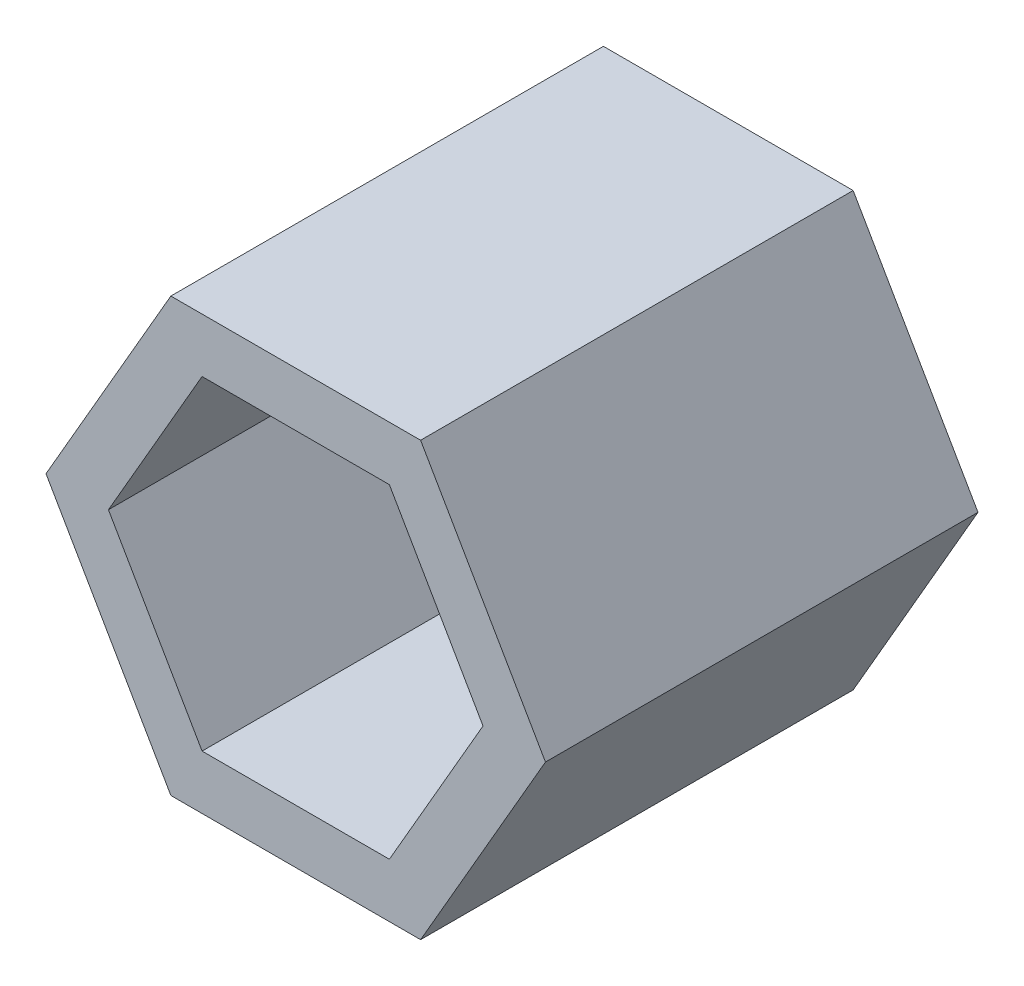
ISO-10303-21;
HEADER;
FILE_DESCRIPTION(('STEP AP214'),'2;1');
FILE_NAME('part.step','',(''),(''),'','','');
FILE_SCHEMA(('AUTOMOTIVE_DESIGN { 1 0 10303 214 1 1 1 1 }'));
ENDSEC;
DATA;
#1=APPLICATION_CONTEXT('core data for automotive mechanical design processes');
#2=APPLICATION_PROTOCOL_DEFINITION('international standard','automotive_design',2000,#1);
#3=PRODUCT_CONTEXT('',#1,'mechanical');
#4=PRODUCT('Part','Part','',(#3));
#5=PRODUCT_RELATED_PRODUCT_CATEGORY('part','',(#4));
#6=PRODUCT_DEFINITION_FORMATION('','',#4);
#7=PRODUCT_DEFINITION_CONTEXT('part definition',#1,'design');
#8=PRODUCT_DEFINITION('design','',#6,#7);
#9=PRODUCT_DEFINITION_SHAPE('','',#8);
#10=(LENGTH_UNIT() NAMED_UNIT(*) SI_UNIT(.MILLI.,.METRE.));
#11=(NAMED_UNIT(*) PLANE_ANGLE_UNIT() SI_UNIT($,.RADIAN.));
#12=(NAMED_UNIT(*) SI_UNIT($,.STERADIAN.) SOLID_ANGLE_UNIT());
#13=UNCERTAINTY_MEASURE_WITH_UNIT(LENGTH_MEASURE(1.E-05),#10,'distance_accuracy_value','');
#14=(GEOMETRIC_REPRESENTATION_CONTEXT(3) GLOBAL_UNCERTAINTY_ASSIGNED_CONTEXT((#13)) GLOBAL_UNIT_ASSIGNED_CONTEXT((#10,
#11,#12)) REPRESENTATION_CONTEXT('',''));
#15=CARTESIAN_POINT('',(0.,0.,0.));
#16=DIRECTION('',(0.,0.,1.));
#17=DIRECTION('',(1.,0.,0.));
#18=AXIS2_PLACEMENT_3D('',#15,#16,#17);
#19=CARTESIAN_POINT('',(-7.33234841868,-1.45519152284E-10,0.));
#20=DIRECTION('',(-0.86602540377695,-0.500000000012971,0.));
#21=DIRECTION('',(0.500000000012971,-0.86602540377695,0.));
#22=AXIS2_PLACEMENT_3D('',#19,#20,#21);
#23=PLANE('',#22);
#24=DIRECTION('',(0.50000000001336,-0.866025403776725,0.));
#25=VECTOR('',#24,1.);
#26=CARTESIAN_POINT('',(-7.33234841868,-1.45519152284E-10,12.7));
#27=LINE('',#26,#25);
#28=CARTESIAN_POINT('',(-7.33234841867697,-1.47268230269864E-10,12.699999999475));
#29=VERTEX_POINT('',#28);
#30=CARTESIAN_POINT('',(-3.66617420921142,-6.35000000012082,12.699999999475));
#31=VERTEX_POINT('',#30);
#32=EDGE_CURVE('E171',#29,#31,#27,.T.);
#33=ORIENTED_EDGE('',*,*,#32,.F.);
#34=DIRECTION('',(0.,0.,1.));
#35=VECTOR('',#34,1.);
#36=CARTESIAN_POINT('',(-7.33234841867394,-1.49017083395098E-10,0.));
#37=LINE('',#36,#35);
#38=CARTESIAN_POINT('',(-7.33234841867849,-1.4639394240054E-10,0.));
#39=VERTEX_POINT('',#38);
#40=EDGE_CURVE('E111',#39,#29,#37,.T.);
#41=ORIENTED_EDGE('',*,*,#40,.F.);
#42=DIRECTION('',(0.50000000001336,-0.866025403776725,0.));
#43=VECTOR('',#42,1.);
#44=CARTESIAN_POINT('',(-7.33234841868,-1.45519152284E-10,0.));
#45=LINE('',#44,#43);
#46=CARTESIAN_POINT('',(-3.66617420921142,-6.35000000012082,0.));
#47=VERTEX_POINT('',#46);
#48=EDGE_CURVE('E108',#39,#47,#45,.T.);
#49=ORIENTED_EDGE('',*,*,#48,.T.);
#50=DIRECTION('',(0.,0.,1.));
#51=VECTOR('',#50,1.);
#52=CARTESIAN_POINT('',(-3.66617420921,-6.35000000012,0.));
#53=LINE('',#52,#51);
#54=EDGE_CURVE('E20',#31,#47,#53,.F.);
#55=ORIENTED_EDGE('',*,*,#54,.F.);
#56=EDGE_LOOP('',(#33,#41,#49,#55));
#57=FACE_BOUND('',#56,.T.);
#58=ADVANCED_FACE('F17',(#57),#23,.T.);
#59=CARTESIAN_POINT('',(-3.66617420921,-6.35000000012,0.));
#60=DIRECTION('',(2.97692581697E-11,-1.,0.));
#61=DIRECTION('',(1.,2.97692581697E-11,0.));
#62=AXIS2_PLACEMENT_3D('',#59,#60,#61);
#63=PLANE('',#62);
#64=DIRECTION('',(1.,0.,0.));
#65=VECTOR('',#64,1.);
#66=CARTESIAN_POINT('',(2.60014232367E-12,-6.35000000012,12.7));
#67=LINE('',#66,#65);
#68=CARTESIAN_POINT('',(3.66617420946825,-6.34999999995586,12.699999999475));
#69=VERTEX_POINT('',#68);
#70=EDGE_CURVE('E118',#31,#69,#67,.T.);
#71=ORIENTED_EDGE('',*,*,#70,.F.);
#72=ORIENTED_EDGE('',*,*,#54,.T.);
#73=DIRECTION('',(1.,0.,0.));
#74=VECTOR('',#73,1.);
#75=CARTESIAN_POINT('',(2.60030727739E-12,-6.35000000012,0.));
#76=LINE('',#75,#74);
#77=CARTESIAN_POINT('',(3.66617420946825,-6.34999999995586,0.));
#78=VERTEX_POINT('',#77);
#79=EDGE_CURVE('E103',#47,#78,#76,.T.);
#80=ORIENTED_EDGE('',*,*,#79,.T.);
#81=DIRECTION('',(0.,0.,1.));
#82=VECTOR('',#81,1.);
#83=CARTESIAN_POINT('',(3.6661742095,-6.3499999999,0.));
#84=LINE('',#83,#82);
#85=EDGE_CURVE('E114',#69,#78,#84,.F.);
#86=ORIENTED_EDGE('',*,*,#85,.F.);
#87=EDGE_LOOP('',(#71,#72,#80,#86));
#88=FACE_BOUND('',#87,.T.);
#89=ADVANCED_FACE('F116',(#88),#63,.T.);
#90=CARTESIAN_POINT('',(-2.74963065702,-4.7625,0.));
#91=DIRECTION('',(0.,-1.,0.));
#92=DIRECTION('',(0.,0.,-1.));
#93=AXIS2_PLACEMENT_3D('',#90,#91,#92);
#94=PLANE('',#93);
#95=DIRECTION('',(0.,0.,1.));
#96=VECTOR('',#95,1.);
#97=CARTESIAN_POINT('',(-2.74963065701476,-4.76249999999698,0.));
#98=LINE('',#97,#96);
#99=CARTESIAN_POINT('',(-2.74963065701738,-4.76249999999849,0.));
#100=VERTEX_POINT('',#99);
#101=CARTESIAN_POINT('',(-2.74963065701869,-4.76249999999924,12.699999999475));
#102=VERTEX_POINT('',#101);
#103=EDGE_CURVE('E120',#100,#102,#98,.T.);
#104=ORIENTED_EDGE('',*,*,#103,.T.);
#105=DIRECTION('',(1.,0.,0.));
#106=VECTOR('',#105,1.);
#107=CARTESIAN_POINT('',(2.60014232367E-12,-4.7625,12.7));
#108=LINE('',#107,#106);
#109=CARTESIAN_POINT('',(2.74963065702813,-4.76249999999892,12.699999999475));
#110=VERTEX_POINT('',#109);
#111=EDGE_CURVE('E145',#110,#102,#108,.F.);
#112=ORIENTED_EDGE('',*,*,#111,.F.);
#113=DIRECTION('',(0.,0.,1.));
#114=VECTOR('',#113,1.);
#115=CARTESIAN_POINT('',(2.7496306570225,-4.76249999999567,0.));
#116=LINE('',#115,#114);
#117=CARTESIAN_POINT('',(2.74963065702625,-4.76249999999783,0.));
#118=VERTEX_POINT('',#117);
#119=EDGE_CURVE('E131',#110,#118,#116,.F.);
#120=ORIENTED_EDGE('',*,*,#119,.T.);
#121=DIRECTION('',(1.,0.,0.));
#122=VECTOR('',#121,1.);
#123=CARTESIAN_POINT('',(2.60030727739E-12,-4.7625,0.));
#124=LINE('',#123,#122);
#125=EDGE_CURVE('E148',#118,#100,#124,.F.);
#126=ORIENTED_EDGE('',*,*,#125,.T.);
#127=EDGE_LOOP('',(#104,#112,#120,#126));
#128=FACE_BOUND('',#127,.T.);
#129=ADVANCED_FACE('F143',(#128),#94,.F.);
#130=CARTESIAN_POINT('',(-5.49926131403,0.,0.));
#131=DIRECTION('',(-0.866025403784329,-0.50000000000019,0.));
#132=DIRECTION('',(0.50000000000019,-0.866025403784329,0.));
#133=AXIS2_PLACEMENT_3D('',#130,#131,#132);
#134=PLANE('',#133);
#135=DIRECTION('',(0.,0.,1.));
#136=VECTOR('',#135,1.);
#137=CARTESIAN_POINT('',(-5.49926131403524,3.02275565688959E-12,0.));
#138=LINE('',#137,#136);
#139=CARTESIAN_POINT('',(-5.49926131403131,7.54719637480192E-13,0.));
#140=VERTEX_POINT('',#139);
#141=CARTESIAN_POINT('',(-5.49926131403131,7.54719637480192E-13,12.699999999475));
#142=VERTEX_POINT('',#141);
#143=EDGE_CURVE('E139',#140,#142,#138,.T.);
#144=ORIENTED_EDGE('',*,*,#143,.T.);
#145=DIRECTION('',(-0.499999999999237,0.866025403784879,0.));
#146=VECTOR('',#145,1.);
#147=CARTESIAN_POINT('',(-2.74963065702,-4.7625,12.7));
#148=LINE('',#147,#146);
#149=EDGE_CURVE('E152',#102,#142,#148,.T.);
#150=ORIENTED_EDGE('',*,*,#149,.F.);
#151=ORIENTED_EDGE('',*,*,#103,.F.);
#152=DIRECTION('',(-0.499999999999237,0.866025403784879,0.));
#153=VECTOR('',#152,1.);
#154=CARTESIAN_POINT('',(-2.74963065702,-4.7625,0.));
#155=LINE('',#154,#153);
#156=EDGE_CURVE('E126',#100,#140,#155,.T.);
#157=ORIENTED_EDGE('',*,*,#156,.T.);
#158=EDGE_LOOP('',(#144,#150,#151,#157));
#159=FACE_BOUND('',#158,.T.);
#160=ADVANCED_FACE('F153',(#159),#134,.F.);
#161=CARTESIAN_POINT('',(-2.74963065702,4.7625,0.));
#162=DIRECTION('',(-0.866025403784329,0.50000000000019,0.));
#163=DIRECTION('',(-0.50000000000019,-0.866025403784329,0.));
#164=AXIS2_PLACEMENT_3D('',#161,#162,#163);
#165=PLANE('',#164);
#166=DIRECTION('',(0.,0.,1.));
#167=VECTOR('',#166,1.);
#168=CARTESIAN_POINT('',(-2.74963065702,4.7625,0.));
#169=LINE('',#168,#167);
#170=CARTESIAN_POINT('',(-2.74963065702,4.7625,0.));
#171=VERTEX_POINT('',#170);
#172=CARTESIAN_POINT('',(-2.74963065702,4.7625,12.699999999475));
#173=VERTEX_POINT('',#172);
#174=EDGE_CURVE('E137',#171,#173,#169,.T.);
#175=ORIENTED_EDGE('',*,*,#174,.T.);
#176=DIRECTION('',(0.499999999999237,0.866025403784879,0.));
#177=VECTOR('',#176,1.);
#178=CARTESIAN_POINT('',(-5.49926131403,0.,12.7));
#179=LINE('',#178,#177);
#180=EDGE_CURVE('E158',#142,#173,#179,.T.);
#181=ORIENTED_EDGE('',*,*,#180,.F.);
#182=ORIENTED_EDGE('',*,*,#143,.F.);
#183=DIRECTION('',(0.499999999999237,0.866025403784879,0.));
#184=VECTOR('',#183,1.);
#185=CARTESIAN_POINT('',(-5.49926131403,0.,0.));
#186=LINE('',#185,#184);
#187=EDGE_CURVE('E187',#140,#171,#186,.T.);
#188=ORIENTED_EDGE('',*,*,#187,.T.);
#189=EDGE_LOOP('',(#175,#181,#182,#188));
#190=FACE_BOUND('',#189,.T.);
#191=ADVANCED_FACE('F191',(#190),#165,.F.);
#192=CARTESIAN_POINT('',(2.74963065702,4.7625,0.));
#193=DIRECTION('',(0.,1.,0.));
#194=DIRECTION('',(-1.,0.,0.));
#195=AXIS2_PLACEMENT_3D('',#192,#193,#194);
#196=PLANE('',#195);
#197=DIRECTION('',(0.,0.,1.));
#198=VECTOR('',#197,1.);
#199=CARTESIAN_POINT('',(2.74963065701476,4.76249999999698,0.));
#200=LINE('',#199,#198);
#201=CARTESIAN_POINT('',(2.74963065701869,4.76249999999924,0.));
#202=VERTEX_POINT('',#201);
#203=CARTESIAN_POINT('',(2.74963065701869,4.76249999999924,12.699999999475));
#204=VERTEX_POINT('',#203);
#205=EDGE_CURVE('E135',#202,#204,#200,.T.);
#206=ORIENTED_EDGE('',*,*,#205,.T.);
#207=DIRECTION('',(1.,0.,0.));
#208=VECTOR('',#207,1.);
#209=CARTESIAN_POINT('',(2.60014232367E-12,4.7625,12.7));
#210=LINE('',#209,#208);
#211=EDGE_CURVE('E206',#173,#204,#210,.T.);
#212=ORIENTED_EDGE('',*,*,#211,.F.);
#213=ORIENTED_EDGE('',*,*,#174,.F.);
#214=DIRECTION('',(1.,0.,0.));
#215=VECTOR('',#214,1.);
#216=CARTESIAN_POINT('',(2.60030727739E-12,4.7625,0.));
#217=LINE('',#216,#215);
#218=EDGE_CURVE('E185',#171,#202,#217,.T.);
#219=ORIENTED_EDGE('',*,*,#218,.T.);
#220=EDGE_LOOP('',(#206,#212,#213,#219));
#221=FACE_BOUND('',#220,.T.);
#222=ADVANCED_FACE('F198',(#221),#196,.F.);
#223=CARTESIAN_POINT('',(5.49926131403,0.,0.));
#224=DIRECTION('',(0.866025403784329,0.50000000000019,0.));
#225=DIRECTION('',(-0.50000000000019,0.866025403784329,0.));
#226=AXIS2_PLACEMENT_3D('',#223,#224,#225);
#227=PLANE('',#226);
#228=DIRECTION('',(0.,0.,1.));
#229=VECTOR('',#228,1.);
#230=CARTESIAN_POINT('',(5.49926131403524,-3.02622510384154E-12,0.));
#231=LINE('',#230,#229);
#232=CARTESIAN_POINT('',(5.49926131403131,-7.57854823525231E-13,0.));
#233=VERTEX_POINT('',#232);
#234=CARTESIAN_POINT('',(5.49926131403131,-7.57854823525231E-13,12.699999999475));
#235=VERTEX_POINT('',#234);
#236=EDGE_CURVE('E133',#233,#235,#231,.T.);
#237=ORIENTED_EDGE('',*,*,#236,.T.);
#238=DIRECTION('',(0.499999999999237,-0.866025403784879,0.));
#239=VECTOR('',#238,1.);
#240=CARTESIAN_POINT('',(2.74963065702,4.7625,12.7));
#241=LINE('',#240,#239);
#242=EDGE_CURVE('E204',#204,#235,#241,.T.);
#243=ORIENTED_EDGE('',*,*,#242,.F.);
#244=ORIENTED_EDGE('',*,*,#205,.F.);
#245=DIRECTION('',(0.499999999999237,-0.866025403784879,0.));
#246=VECTOR('',#245,1.);
#247=CARTESIAN_POINT('',(2.74963065702,4.7625,0.));
#248=LINE('',#247,#246);
#249=EDGE_CURVE('E183',#202,#233,#248,.T.);
#250=ORIENTED_EDGE('',*,*,#249,.T.);
#251=EDGE_LOOP('',(#237,#243,#244,#250));
#252=FACE_BOUND('',#251,.T.);
#253=ADVANCED_FACE('F202',(#252),#227,.F.);
#254=CARTESIAN_POINT('',(2.74963065702,-4.7625,0.));
#255=DIRECTION('',(0.866025403784329,-0.50000000000019,0.));
#256=DIRECTION('',(0.50000000000019,0.866025403784329,0.));
#257=AXIS2_PLACEMENT_3D('',#254,#255,#256);
#258=PLANE('',#257);
#259=ORIENTED_EDGE('',*,*,#119,.F.);
#260=DIRECTION('',(-0.499999999997874,-0.866025403785666,0.));
#261=VECTOR('',#260,1.);
#262=CARTESIAN_POINT('',(5.49926131403,0.,12.7));
#263=LINE('',#262,#261);
#264=EDGE_CURVE('E164',#235,#110,#263,.T.);
#265=ORIENTED_EDGE('',*,*,#264,.F.);
#266=ORIENTED_EDGE('',*,*,#236,.F.);
#267=DIRECTION('',(-0.499999999997874,-0.866025403785666,0.));
#268=VECTOR('',#267,1.);
#269=CARTESIAN_POINT('',(5.49926131403,0.,0.));
#270=LINE('',#269,#268);
#271=EDGE_CURVE('E180',#233,#118,#270,.T.);
#272=ORIENTED_EDGE('',*,*,#271,.T.);
#273=EDGE_LOOP('',(#259,#265,#266,#272));
#274=FACE_BOUND('',#273,.T.);
#275=ADVANCED_FACE('F237',(#274),#258,.F.);
#276=CARTESIAN_POINT('',(3.6661742095,-6.3499999999,0.));
#277=DIRECTION('',(0.866025403796672,-0.499999999978811,0.));
#278=DIRECTION('',(0.499999999978811,0.866025403796672,0.));
#279=AXIS2_PLACEMENT_3D('',#276,#277,#278);
#280=PLANE('',#279);
#281=DIRECTION('',(0.499999999979501,0.866025403796274,0.));
#282=VECTOR('',#281,1.);
#283=CARTESIAN_POINT('',(3.6661742095,-6.3499999999,12.7));
#284=LINE('',#283,#282);
#285=CARTESIAN_POINT('',(7.33234841867873,1.46251612597376E-10,12.69999999965));
#286=VERTEX_POINT('',#285);
#287=EDGE_CURVE('E165',#69,#286,#284,.T.);
#288=ORIENTED_EDGE('',*,*,#287,.F.);
#289=ORIENTED_EDGE('',*,*,#85,.T.);
#290=DIRECTION('',(0.499999999979501,0.866025403796274,0.));
#291=VECTOR('',#290,1.);
#292=CARTESIAN_POINT('',(3.6661742095,-6.3499999999,0.));
#293=LINE('',#292,#291);
#294=CARTESIAN_POINT('',(7.33234841867873,1.46251070496289E-10,0.));
#295=VERTEX_POINT('',#294);
#296=EDGE_CURVE('E124',#78,#295,#293,.T.);
#297=ORIENTED_EDGE('',*,*,#296,.T.);
#298=DIRECTION('',(0.,0.,1.));
#299=VECTOR('',#298,1.);
#300=CARTESIAN_POINT('',(7.33234841868,1.45519152284E-10,0.));
#301=LINE('',#300,#299);
#302=EDGE_CURVE('E215',#286,#295,#301,.F.);
#303=ORIENTED_EDGE('',*,*,#302,.F.);
#304=EDGE_LOOP('',(#288,#289,#297,#303));
#305=FACE_BOUND('',#304,.T.);
#306=ADVANCED_FACE('F235',(#305),#280,.T.);
#307=CARTESIAN_POINT('',(2.60030727739E-12,-2.1533018192E-11,0.));
#308=DIRECTION('',(0.,0.,1.));
#309=DIRECTION('',(1.,0.,0.));
#310=AXIS2_PLACEMENT_3D('',#307,#308,#309);
#311=PLANE('',#310);
#312=ORIENTED_EDGE('',*,*,#271,.F.);
#313=ORIENTED_EDGE('',*,*,#249,.F.);
#314=ORIENTED_EDGE('',*,*,#218,.F.);
#315=ORIENTED_EDGE('',*,*,#187,.F.);
#316=ORIENTED_EDGE('',*,*,#156,.F.);
#317=ORIENTED_EDGE('',*,*,#125,.F.);
#318=EDGE_LOOP('',(#312,#313,#314,#315,#316,#317));
#319=FACE_BOUND('',#318,.T.);
#320=DIRECTION('',(-1.,9.92275706047E-12,0.));
#321=VECTOR('',#320,1.);
#322=CARTESIAN_POINT('',(3.66617420943,6.3499999999,0.));
#323=LINE('',#322,#321);
#324=CARTESIAN_POINT('',(3.66617420942962,6.34999999989978,0.));
#325=VERTEX_POINT('',#324);
#326=CARTESIAN_POINT('',(-3.66617420984083,6.34999999987831,0.));
#327=VERTEX_POINT('',#326);
#328=EDGE_CURVE('E218',#325,#327,#323,.T.);
#329=ORIENTED_EDGE('',*,*,#328,.F.);
#330=DIRECTION('',(-0.500000000004056,0.866025403782097,0.));
#331=VECTOR('',#330,1.);
#332=CARTESIAN_POINT('',(7.33234841868,1.45519152284E-10,0.));
#333=LINE('',#332,#331);
#334=EDGE_CURVE('E211',#295,#325,#333,.T.);
#335=ORIENTED_EDGE('',*,*,#334,.F.);
#336=ORIENTED_EDGE('',*,*,#296,.F.);
#337=ORIENTED_EDGE('',*,*,#79,.F.);
#338=ORIENTED_EDGE('',*,*,#48,.F.);
#339=DIRECTION('',(-0.499999999985793,-0.866025403792641,0.));
#340=VECTOR('',#339,1.);
#341=CARTESIAN_POINT('',(-3.66617420939,6.34999999997,0.));
#342=LINE('',#341,#340);
#343=EDGE_CURVE('E177',#327,#39,#342,.T.);
#344=ORIENTED_EDGE('',*,*,#343,.F.);
#345=EDGE_LOOP('',(#329,#335,#336,#337,#338,#344));
#346=FACE_BOUND('',#345,.T.);
#347=ADVANCED_FACE('F122',(#319,#346),#311,.F.);
#348=CARTESIAN_POINT('',(-3.66617420939,6.34999999997,0.));
#349=DIRECTION('',(-0.866025403792641,0.499999999985793,0.));
#350=DIRECTION('',(-0.499999999985793,-0.866025403792641,0.));
#351=AXIS2_PLACEMENT_3D('',#348,#349,#350);
#352=PLANE('',#351);
#353=DIRECTION('',(-0.499999999932407,-0.866025403823463,0.));
#354=VECTOR('',#353,1.);
#355=CARTESIAN_POINT('',(-3.66617420992,6.34999999997,12.7));
#356=LINE('',#355,#354);
#357=CARTESIAN_POINT('',(-3.66617420973135,6.34999999983844,12.699999999475));
#358=VERTEX_POINT('',#357);
#359=EDGE_CURVE('E173',#358,#29,#356,.T.);
#360=ORIENTED_EDGE('',*,*,#359,.F.);
#361=DIRECTION('',(0.,0.,1.));
#362=VECTOR('',#361,1.);
#363=CARTESIAN_POINT('',(-3.66617420992,6.34999999997276,0.));
#364=LINE('',#363,#362);
#365=EDGE_CURVE('E221',#327,#358,#364,.T.);
#366=ORIENTED_EDGE('',*,*,#365,.F.);
#367=ORIENTED_EDGE('',*,*,#343,.T.);
#368=ORIENTED_EDGE('',*,*,#40,.T.);
#369=EDGE_LOOP('',(#360,#366,#367,#368));
#370=FACE_BOUND('',#369,.T.);
#371=ADVANCED_FACE('F229',(#370),#352,.T.);
#372=CARTESIAN_POINT('',(2.60014232367E-12,-2.15327755626E-11,12.7));
#373=DIRECTION('',(0.,0.,1.));
#374=DIRECTION('',(1.,0.,0.));
#375=AXIS2_PLACEMENT_3D('',#372,#373,#374);
#376=PLANE('',#375);
#377=ORIENTED_EDGE('',*,*,#242,.T.);
#378=ORIENTED_EDGE('',*,*,#264,.T.);
#379=ORIENTED_EDGE('',*,*,#111,.T.);
#380=ORIENTED_EDGE('',*,*,#149,.T.);
#381=ORIENTED_EDGE('',*,*,#180,.T.);
#382=ORIENTED_EDGE('',*,*,#211,.T.);
#383=EDGE_LOOP('',(#377,#378,#379,#380,#381,#382));
#384=FACE_BOUND('',#383,.T.);
#385=DIRECTION('',(-0.500000000004056,0.866025403782097,0.));
#386=VECTOR('',#385,1.);
#387=CARTESIAN_POINT('',(7.33234841868,1.45519152284E-10,12.6999999993));
#388=LINE('',#387,#386);
#389=CARTESIAN_POINT('',(3.66617420942962,6.34999999989978,12.69999999965));
#390=VERTEX_POINT('',#389);
#391=EDGE_CURVE('E35',#390,#286,#388,.F.);
#392=ORIENTED_EDGE('',*,*,#391,.F.);
#393=DIRECTION('',(-1.,9.92275706047E-12,0.));
#394=VECTOR('',#393,1.);
#395=CARTESIAN_POINT('',(3.66617420943,6.3499999999,12.6999999993));
#396=LINE('',#395,#394);
#397=EDGE_CURVE('E26',#358,#390,#396,.F.);
#398=ORIENTED_EDGE('',*,*,#397,.F.);
#399=ORIENTED_EDGE('',*,*,#359,.T.);
#400=ORIENTED_EDGE('',*,*,#32,.T.);
#401=ORIENTED_EDGE('',*,*,#70,.T.);
#402=ORIENTED_EDGE('',*,*,#287,.T.);
#403=EDGE_LOOP('',(#392,#398,#399,#400,#401,#402));
#404=FACE_BOUND('',#403,.T.);
#405=ADVANCED_FACE('F162',(#384,#404),#376,.T.);
#406=CARTESIAN_POINT('',(7.33234841868,1.45519152284E-10,0.));
#407=DIRECTION('',(0.866025403782097,0.500000000004056,0.));
#408=DIRECTION('',(-0.500000000004056,0.866025403782097,0.));
#409=AXIS2_PLACEMENT_3D('',#406,#407,#408);
#410=PLANE('',#409);
#411=ORIENTED_EDGE('',*,*,#391,.T.);
#412=ORIENTED_EDGE('',*,*,#302,.T.);
#413=ORIENTED_EDGE('',*,*,#334,.T.);
#414=DIRECTION('',(0.,0.,1.));
#415=VECTOR('',#414,1.);
#416=CARTESIAN_POINT('',(3.66617420943,6.3499999999,0.));
#417=LINE('',#416,#415);
#418=EDGE_CURVE('E11',#390,#325,#417,.F.);
#419=ORIENTED_EDGE('',*,*,#418,.F.);
#420=EDGE_LOOP('',(#411,#412,#413,#419));
#421=FACE_BOUND('',#420,.T.);
#422=ADVANCED_FACE('F231',(#421),#410,.T.);
#423=CARTESIAN_POINT('',(3.66617420943,6.3499999999,0.));
#424=DIRECTION('',(9.92275706047E-12,1.,0.));
#425=DIRECTION('',(-1.,9.92275706047E-12,0.));
#426=AXIS2_PLACEMENT_3D('',#423,#424,#425);
#427=PLANE('',#426);
#428=ORIENTED_EDGE('',*,*,#397,.T.);
#429=ORIENTED_EDGE('',*,*,#418,.T.);
#430=ORIENTED_EDGE('',*,*,#328,.T.);
#431=ORIENTED_EDGE('',*,*,#365,.T.);
#432=EDGE_LOOP('',(#428,#429,#430,#431));
#433=FACE_BOUND('',#432,.T.);
#434=ADVANCED_FACE('F226',(#433),#427,.T.);
#435=CLOSED_SHELL('',(#58,#89,#129,#160,#191,#222,#253,#275,#306,#347,#371,#405,#422,#434));
#436=MANIFOLD_SOLID_BREP('B1',#435);
#437=ADVANCED_BREP_SHAPE_REPRESENTATION('',(#18,#436),#14);
#438=SHAPE_DEFINITION_REPRESENTATION(#9,#437);
ENDSEC;
END-ISO-10303-21;
